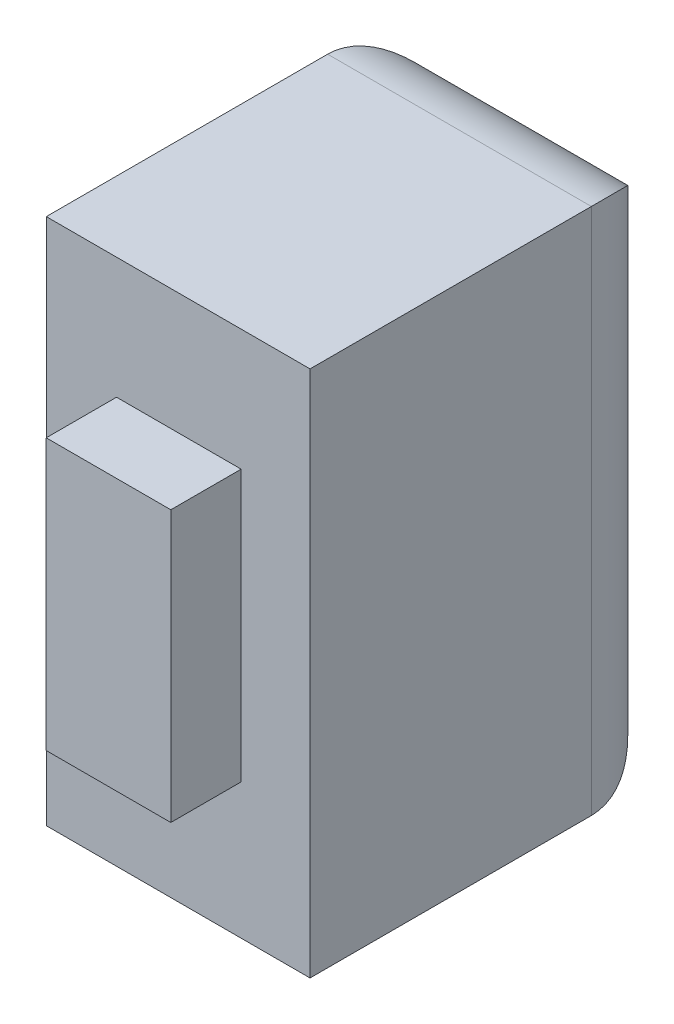
ISO-10303-21;
HEADER;
FILE_DESCRIPTION(('STEP AP214'),'2;1');
FILE_NAME('part.step','',(''),(''),'','','');
FILE_SCHEMA(('AUTOMOTIVE_DESIGN { 1 0 10303 214 1 1 1 1 }'));
ENDSEC;
DATA;
#1=APPLICATION_CONTEXT('core data for automotive mechanical design processes');
#2=APPLICATION_PROTOCOL_DEFINITION('international standard','automotive_design',2000,#1);
#3=PRODUCT_CONTEXT('',#1,'mechanical');
#4=PRODUCT('Part','Part','',(#3));
#5=PRODUCT_RELATED_PRODUCT_CATEGORY('part','',(#4));
#6=PRODUCT_DEFINITION_FORMATION('','',#4);
#7=PRODUCT_DEFINITION_CONTEXT('part definition',#1,'design');
#8=PRODUCT_DEFINITION('design','',#6,#7);
#9=PRODUCT_DEFINITION_SHAPE('','',#8);
#10=(LENGTH_UNIT() NAMED_UNIT(*) SI_UNIT(.MILLI.,.METRE.));
#11=(NAMED_UNIT(*) PLANE_ANGLE_UNIT() SI_UNIT($,.RADIAN.));
#12=(NAMED_UNIT(*) SI_UNIT($,.STERADIAN.) SOLID_ANGLE_UNIT());
#13=UNCERTAINTY_MEASURE_WITH_UNIT(LENGTH_MEASURE(1.E-05),#10,'distance_accuracy_value','');
#14=(GEOMETRIC_REPRESENTATION_CONTEXT(3) GLOBAL_UNCERTAINTY_ASSIGNED_CONTEXT((#13)) GLOBAL_UNIT_ASSIGNED_CONTEXT((#10,
#11,#12)) REPRESENTATION_CONTEXT('',''));
#15=CARTESIAN_POINT('',(0.,0.,0.));
#16=DIRECTION('',(0.,0.,1.));
#17=DIRECTION('',(1.,0.,0.));
#18=AXIS2_PLACEMENT_3D('',#15,#16,#17);
#19=CARTESIAN_POINT('',(-2.03853997780115,1.18298219692962,3.5));
#20=DIRECTION('',(1.,0.,0.));
#21=DIRECTION('',(0.,1.,0.));
#22=AXIS2_PLACEMENT_3D('',#19,#20,#21);
#23=PLANE('',#22);
#24=DIRECTION('',(0.,0.,-1.));
#25=VECTOR('',#24,1.);
#26=CARTESIAN_POINT('',(-2.03853997780115,1.18298219692962,3.5));
#27=LINE('',#26,#25);
#28=CARTESIAN_POINT('',(-2.03853997780115,1.18298219692962,2.7));
#29=VERTEX_POINT('',#28);
#30=CARTESIAN_POINT('',(-2.03853997780115,1.18298219692962,-0.5));
#31=VERTEX_POINT('',#30);
#32=EDGE_CURVE('E172',#29,#31,#27,.T.);
#33=ORIENTED_EDGE('',*,*,#32,.T.);
#34=DIRECTION('',(0.,1.,0.));
#35=VECTOR('',#34,1.);
#36=CARTESIAN_POINT('',(-2.03853997780115,-4.81701780307038,-0.5));
#37=LINE('',#36,#35);
#38=CARTESIAN_POINT('',(-2.03853997780115,-4.81701780307038,-0.5));
#39=VERTEX_POINT('',#38);
#40=EDGE_CURVE('E51',#31,#39,#37,.F.);
#41=ORIENTED_EDGE('',*,*,#40,.T.);
#42=DIRECTION('',(0.,0.,-1.));
#43=VECTOR('',#42,1.);
#44=CARTESIAN_POINT('',(-2.03853997780115,-4.81701780307038,3.5));
#45=LINE('',#44,#43);
#46=CARTESIAN_POINT('',(-2.03853997780115,-4.81701780307038,2.7));
#47=VERTEX_POINT('',#46);
#48=EDGE_CURVE('E179',#47,#39,#45,.T.);
#49=ORIENTED_EDGE('',*,*,#48,.F.);
#50=DIRECTION('',(0.,-1.,0.));
#51=VECTOR('',#50,1.);
#52=CARTESIAN_POINT('',(-2.03853997780115,1.18298219692962,2.7));
#53=LINE('',#52,#51);
#54=EDGE_CURVE('E170',#29,#47,#53,.T.);
#55=ORIENTED_EDGE('',*,*,#54,.F.);
#56=EDGE_LOOP('',(#33,#41,#49,#55));
#57=FACE_BOUND('',#56,.T.);
#58=ADVANCED_FACE('F42',(#57),#23,.F.);
#59=CARTESIAN_POINT('',(-2.03853997780115,-4.81701780307038,3.5));
#60=DIRECTION('',(0.,1.,0.));
#61=DIRECTION('',(0.,0.,1.));
#62=AXIS2_PLACEMENT_3D('',#59,#60,#61);
#63=PLANE('',#62);
#64=ORIENTED_EDGE('',*,*,#48,.T.);
#65=DIRECTION('',(-1.,0.,0.));
#66=VECTOR('',#65,1.);
#67=CARTESIAN_POINT('',(0.961460022198854,-4.81701780307038,-0.5));
#68=LINE('',#67,#66);
#69=CARTESIAN_POINT('',(0.961460022198855,-4.81701780307038,-0.5));
#70=VERTEX_POINT('',#69);
#71=EDGE_CURVE('E59',#39,#70,#68,.F.);
#72=ORIENTED_EDGE('',*,*,#71,.T.);
#73=DIRECTION('',(0.,0.,-1.));
#74=VECTOR('',#73,1.);
#75=CARTESIAN_POINT('',(0.961460022198855,-4.81701780307038,3.5));
#76=LINE('',#75,#74);
#77=CARTESIAN_POINT('',(0.961460022198855,-4.81701780307038,2.7));
#78=VERTEX_POINT('',#77);
#79=EDGE_CURVE('E177',#78,#70,#76,.T.);
#80=ORIENTED_EDGE('',*,*,#79,.F.);
#81=DIRECTION('',(1.,0.,0.));
#82=VECTOR('',#81,1.);
#83=CARTESIAN_POINT('',(-2.03853997780115,-4.81701780307038,2.7));
#84=LINE('',#83,#82);
#85=EDGE_CURVE('E168',#47,#78,#84,.T.);
#86=ORIENTED_EDGE('',*,*,#85,.F.);
#87=EDGE_LOOP('',(#64,#72,#80,#86));
#88=FACE_BOUND('',#87,.T.);
#89=ADVANCED_FACE('F242',(#88),#63,.F.);
#90=CARTESIAN_POINT('',(0.961460022198854,1.18298219692962,3.5));
#91=DIRECTION('',(-1.,0.,0.));
#92=DIRECTION('',(0.,-1.,0.));
#93=AXIS2_PLACEMENT_3D('',#90,#91,#92);
#94=PLANE('',#93);
#95=ORIENTED_EDGE('',*,*,#79,.T.);
#96=DIRECTION('',(0.,-1.,0.));
#97=VECTOR('',#96,1.);
#98=CARTESIAN_POINT('',(0.961460022198854,1.18298219692962,-0.5));
#99=LINE('',#98,#97);
#100=CARTESIAN_POINT('',(0.961460022198854,1.18298219692962,-0.5));
#101=VERTEX_POINT('',#100);
#102=EDGE_CURVE('E12',#70,#101,#99,.F.);
#103=ORIENTED_EDGE('',*,*,#102,.T.);
#104=DIRECTION('',(0.,0.,-1.));
#105=VECTOR('',#104,1.);
#106=CARTESIAN_POINT('',(0.961460022198854,1.18298219692962,3.5));
#107=LINE('',#106,#105);
#108=CARTESIAN_POINT('',(0.961460022198854,1.18298219692962,2.7));
#109=VERTEX_POINT('',#108);
#110=EDGE_CURVE('E174',#109,#101,#107,.T.);
#111=ORIENTED_EDGE('',*,*,#110,.F.);
#112=DIRECTION('',(0.,1.,0.));
#113=VECTOR('',#112,1.);
#114=CARTESIAN_POINT('',(0.961460022198854,1.18298219692962,2.7));
#115=LINE('',#114,#113);
#116=EDGE_CURVE('E163',#78,#109,#115,.T.);
#117=ORIENTED_EDGE('',*,*,#116,.F.);
#118=EDGE_LOOP('',(#95,#103,#111,#117));
#119=FACE_BOUND('',#118,.T.);
#120=ADVANCED_FACE('F218',(#119),#94,.F.);
#121=CARTESIAN_POINT('',(-2.03853997780115,1.18298219692962,3.5));
#122=DIRECTION('',(0.,-1.,0.));
#123=DIRECTION('',(0.,0.,-1.));
#124=AXIS2_PLACEMENT_3D('',#121,#122,#123);
#125=PLANE('',#124);
#126=ORIENTED_EDGE('',*,*,#110,.T.);
#127=DIRECTION('',(1.,0.,0.));
#128=VECTOR('',#127,1.);
#129=CARTESIAN_POINT('',(-2.03853997780115,1.18298219692962,-0.5));
#130=LINE('',#129,#128);
#131=EDGE_CURVE('E192',#101,#31,#130,.F.);
#132=ORIENTED_EDGE('',*,*,#131,.T.);
#133=ORIENTED_EDGE('',*,*,#32,.F.);
#134=DIRECTION('',(-1.,0.,0.));
#135=VECTOR('',#134,1.);
#136=CARTESIAN_POINT('',(-2.03853997780115,1.18298219692962,2.7));
#137=LINE('',#136,#135);
#138=EDGE_CURVE('E181',#109,#29,#137,.T.);
#139=ORIENTED_EDGE('',*,*,#138,.F.);
#140=EDGE_LOOP('',(#126,#132,#133,#139));
#141=FACE_BOUND('',#140,.T.);
#142=ADVANCED_FACE('F223',(#141),#125,.F.);
#143=CARTESIAN_POINT('',(-0.538539977801145,-1.81701780307038,2.7));
#144=DIRECTION('',(0.,0.,1.));
#145=DIRECTION('',(1.,0.,0.));
#146=AXIS2_PLACEMENT_3D('',#143,#144,#145);
#147=PLANE('',#146);
#148=DIRECTION('',(-1.,0.,0.));
#149=VECTOR('',#148,1.);
#150=CARTESIAN_POINT('',(-1.23949348205275,-0.196449222257141,2.7));
#151=LINE('',#150,#149);
#152=CARTESIAN_POINT('',(0.17791343994133,-0.196449222257141,2.7));
#153=VERTEX_POINT('',#152);
#154=CARTESIAN_POINT('',(-1.23949348205275,-0.196449222257141,2.7));
#155=VERTEX_POINT('',#154);
#156=EDGE_CURVE('E134',#153,#155,#151,.T.);
#157=ORIENTED_EDGE('',*,*,#156,.F.);
#158=DIRECTION('',(0.,1.,0.));
#159=VECTOR('',#158,1.);
#160=CARTESIAN_POINT('',(0.17791343994133,-0.196449222257141,2.7));
#161=LINE('',#160,#159);
#162=CARTESIAN_POINT('',(0.17791343994133,-3.27694693272427,2.7));
#163=VERTEX_POINT('',#162);
#164=EDGE_CURVE('E144',#163,#153,#161,.T.);
#165=ORIENTED_EDGE('',*,*,#164,.F.);
#166=DIRECTION('',(1.,0.,0.));
#167=VECTOR('',#166,1.);
#168=CARTESIAN_POINT('',(-1.23949348205275,-3.27694693272427,2.7));
#169=LINE('',#168,#167);
#170=CARTESIAN_POINT('',(-1.23949348205275,-3.27694693272427,2.7));
#171=VERTEX_POINT('',#170);
#172=EDGE_CURVE('E126',#171,#163,#169,.T.);
#173=ORIENTED_EDGE('',*,*,#172,.F.);
#174=DIRECTION('',(0.,-1.,0.));
#175=VECTOR('',#174,1.);
#176=CARTESIAN_POINT('',(-1.23949348205275,-0.196449222257141,2.7));
#177=LINE('',#176,#175);
#178=EDGE_CURVE('E141',#155,#171,#177,.T.);
#179=ORIENTED_EDGE('',*,*,#178,.F.);
#180=EDGE_LOOP('',(#157,#165,#173,#179));
#181=FACE_BOUND('',#180,.T.);
#182=ORIENTED_EDGE('',*,*,#54,.T.);
#183=ORIENTED_EDGE('',*,*,#85,.T.);
#184=ORIENTED_EDGE('',*,*,#116,.T.);
#185=ORIENTED_EDGE('',*,*,#138,.T.);
#186=EDGE_LOOP('',(#182,#183,#184,#185));
#187=FACE_BOUND('',#186,.T.);
#188=ADVANCED_FACE('F139',(#181,#187),#147,.T.);
#189=CARTESIAN_POINT('',(-1.23949348205275,-0.196449222257141,2.7));
#190=DIRECTION('',(-1.,0.,0.));
#191=DIRECTION('',(0.,0.,1.));
#192=AXIS2_PLACEMENT_3D('',#189,#190,#191);
#193=PLANE('',#192);
#194=DIRECTION('',(0.,-1.,0.));
#195=VECTOR('',#194,1.);
#196=CARTESIAN_POINT('',(-1.23949348205275,-0.196449222257141,3.5));
#197=LINE('',#196,#195);
#198=CARTESIAN_POINT('',(-1.23949348205275,-0.196449222257141,3.5));
#199=VERTEX_POINT('',#198);
#200=CARTESIAN_POINT('',(-1.23949348205275,-3.27694693272427,3.5));
#201=VERTEX_POINT('',#200);
#202=EDGE_CURVE('E157',#199,#201,#197,.T.);
#203=ORIENTED_EDGE('',*,*,#202,.F.);
#204=DIRECTION('',(0.,0.,1.));
#205=VECTOR('',#204,1.);
#206=CARTESIAN_POINT('',(-1.23949348205275,-0.196449222257141,2.7));
#207=LINE('',#206,#205);
#208=EDGE_CURVE('E148',#155,#199,#207,.T.);
#209=ORIENTED_EDGE('',*,*,#208,.F.);
#210=ORIENTED_EDGE('',*,*,#178,.T.);
#211=DIRECTION('',(0.,0.,1.));
#212=VECTOR('',#211,1.);
#213=CARTESIAN_POINT('',(-1.23949348205275,-3.27694693272427,2.7));
#214=LINE('',#213,#212);
#215=EDGE_CURVE('E122',#171,#201,#214,.T.);
#216=ORIENTED_EDGE('',*,*,#215,.T.);
#217=EDGE_LOOP('',(#203,#209,#210,#216));
#218=FACE_BOUND('',#217,.T.);
#219=ADVANCED_FACE('F147',(#218),#193,.T.);
#220=CARTESIAN_POINT('',(-1.23949348205275,-0.196449222257141,2.7));
#221=DIRECTION('',(0.,1.,0.));
#222=DIRECTION('',(0.,0.,1.));
#223=AXIS2_PLACEMENT_3D('',#220,#221,#222);
#224=PLANE('',#223);
#225=DIRECTION('',(-1.,0.,0.));
#226=VECTOR('',#225,1.);
#227=CARTESIAN_POINT('',(-1.23949348205275,-0.196449222257141,3.5));
#228=LINE('',#227,#226);
#229=CARTESIAN_POINT('',(0.17791343994133,-0.196449222257141,3.5));
#230=VERTEX_POINT('',#229);
#231=EDGE_CURVE('E149',#230,#199,#228,.T.);
#232=ORIENTED_EDGE('',*,*,#231,.F.);
#233=DIRECTION('',(0.,0.,1.));
#234=VECTOR('',#233,1.);
#235=CARTESIAN_POINT('',(0.17791343994133,-0.196449222257141,2.7));
#236=LINE('',#235,#234);
#237=EDGE_CURVE('E164',#153,#230,#236,.T.);
#238=ORIENTED_EDGE('',*,*,#237,.F.);
#239=ORIENTED_EDGE('',*,*,#156,.T.);
#240=ORIENTED_EDGE('',*,*,#208,.T.);
#241=EDGE_LOOP('',(#232,#238,#239,#240));
#242=FACE_BOUND('',#241,.T.);
#243=ADVANCED_FACE('F296',(#242),#224,.T.);
#244=CARTESIAN_POINT('',(0.17791343994133,-0.196449222257141,2.7));
#245=DIRECTION('',(1.,0.,0.));
#246=DIRECTION('',(0.,0.,-1.));
#247=AXIS2_PLACEMENT_3D('',#244,#245,#246);
#248=PLANE('',#247);
#249=DIRECTION('',(0.,1.,0.));
#250=VECTOR('',#249,1.);
#251=CARTESIAN_POINT('',(0.17791343994133,-0.196449222257141,3.5));
#252=LINE('',#251,#250);
#253=CARTESIAN_POINT('',(0.17791343994133,-3.27694693272427,3.5));
#254=VERTEX_POINT('',#253);
#255=EDGE_CURVE('E152',#254,#230,#252,.T.);
#256=ORIENTED_EDGE('',*,*,#255,.F.);
#257=DIRECTION('',(0.,0.,1.));
#258=VECTOR('',#257,1.);
#259=CARTESIAN_POINT('',(0.17791343994133,-3.27694693272427,2.7));
#260=LINE('',#259,#258);
#261=EDGE_CURVE('E133',#163,#254,#260,.T.);
#262=ORIENTED_EDGE('',*,*,#261,.F.);
#263=ORIENTED_EDGE('',*,*,#164,.T.);
#264=ORIENTED_EDGE('',*,*,#237,.T.);
#265=EDGE_LOOP('',(#256,#262,#263,#264));
#266=FACE_BOUND('',#265,.T.);
#267=ADVANCED_FACE('F288',(#266),#248,.T.);
#268=CARTESIAN_POINT('',(-1.23949348205275,-3.27694693272427,2.7));
#269=DIRECTION('',(0.,-1.,0.));
#270=DIRECTION('',(0.,0.,-1.));
#271=AXIS2_PLACEMENT_3D('',#268,#269,#270);
#272=PLANE('',#271);
#273=DIRECTION('',(1.,0.,0.));
#274=VECTOR('',#273,1.);
#275=CARTESIAN_POINT('',(-1.23949348205275,-3.27694693272427,3.5));
#276=LINE('',#275,#274);
#277=EDGE_CURVE('E128',#201,#254,#276,.T.);
#278=ORIENTED_EDGE('',*,*,#277,.F.);
#279=ORIENTED_EDGE('',*,*,#215,.F.);
#280=ORIENTED_EDGE('',*,*,#172,.T.);
#281=ORIENTED_EDGE('',*,*,#261,.T.);
#282=EDGE_LOOP('',(#278,#279,#280,#281));
#283=FACE_BOUND('',#282,.T.);
#284=ADVANCED_FACE('F124',(#283),#272,.T.);
#285=CARTESIAN_POINT('',(0.,0.,3.5));
#286=DIRECTION('',(0.,0.,1.));
#287=DIRECTION('',(1.,0.,0.));
#288=AXIS2_PLACEMENT_3D('',#285,#286,#287);
#289=PLANE('',#288);
#290=ORIENTED_EDGE('',*,*,#231,.T.);
#291=ORIENTED_EDGE('',*,*,#202,.T.);
#292=ORIENTED_EDGE('',*,*,#277,.T.);
#293=ORIENTED_EDGE('',*,*,#255,.T.);
#294=EDGE_LOOP('',(#290,#291,#292,#293));
#295=FACE_BOUND('',#294,.T.);
#296=ADVANCED_FACE('F231',(#295),#289,.T.);
#297=CARTESIAN_POINT('',(0.,0.,-1.5));
#298=DIRECTION('',(0.,0.,-1.));
#299=DIRECTION('',(-1.,0.,0.));
#300=AXIS2_PLACEMENT_3D('',#297,#298,#299);
#301=PLANE('',#300);
#302=DIRECTION('',(-1.,0.,0.));
#303=VECTOR('',#302,1.);
#304=CARTESIAN_POINT('',(-2.03853997780115,-3.81701780307038,-1.5));
#305=LINE('',#304,#303);
#306=CARTESIAN_POINT('',(-0.0385399778011451,-3.81701780307038,-1.5));
#307=VERTEX_POINT('',#306);
#308=CARTESIAN_POINT('',(-1.03853997780115,-3.81701780307038,-1.5));
#309=VERTEX_POINT('',#308);
#310=EDGE_CURVE('E185',#307,#309,#305,.T.);
#311=ORIENTED_EDGE('',*,*,#310,.T.);
#312=DIRECTION('',(0.,1.,0.));
#313=VECTOR('',#312,1.);
#314=CARTESIAN_POINT('',(-1.03853997780115,1.18298219692962,-1.5));
#315=LINE('',#314,#313);
#316=CARTESIAN_POINT('',(-1.03853997780115,0.182982196929617,-1.5));
#317=VERTEX_POINT('',#316);
#318=EDGE_CURVE('E190',#309,#317,#315,.T.);
#319=ORIENTED_EDGE('',*,*,#318,.T.);
#320=DIRECTION('',(1.,0.,0.));
#321=VECTOR('',#320,1.);
#322=CARTESIAN_POINT('',(0.961460022198854,0.182982196929617,-1.5));
#323=LINE('',#322,#321);
#324=CARTESIAN_POINT('',(-0.0385399778011458,0.182982196929617,-1.5));
#325=VERTEX_POINT('',#324);
#326=EDGE_CURVE('E187',#317,#325,#323,.T.);
#327=ORIENTED_EDGE('',*,*,#326,.T.);
#328=DIRECTION('',(0.,-1.,0.));
#329=VECTOR('',#328,1.);
#330=CARTESIAN_POINT('',(-0.0385399778011449,-4.81701780307038,-1.5));
#331=LINE('',#330,#329);
#332=EDGE_CURVE('E183',#325,#307,#331,.T.);
#333=ORIENTED_EDGE('',*,*,#332,.T.);
#334=EDGE_LOOP('',(#311,#319,#327,#333));
#335=FACE_BOUND('',#334,.T.);
#336=ADVANCED_FACE('F229',(#335),#301,.T.);
#337=CARTESIAN_POINT('',(0.,-3.81701780307038,-0.5));
#338=DIRECTION('',(1.,0.,0.));
#339=DIRECTION('',(0.,0.,-1.));
#340=AXIS2_PLACEMENT_3D('',#337,#338,#339);
#341=CYLINDRICAL_SURFACE('',#340,1.);
#342=CARTESIAN_POINT('',(-0.0385399778011451,-3.81701780307038,-0.5));
#343=DIRECTION('',(0.707106781186547,0.707106781186548,0.));
#344=DIRECTION('',(-0.707106781186548,0.707106781186547,0.));
#345=AXIS2_PLACEMENT_3D('',#342,#343,#344);
#346=ELLIPSE('',#345,1.4142135623731,1.);
#347=EDGE_CURVE('E200',#70,#307,#346,.T.);
#348=ORIENTED_EDGE('',*,*,#347,.F.);
#349=ORIENTED_EDGE('',*,*,#71,.F.);
#350=CARTESIAN_POINT('',(-1.03853997780115,-3.81701780307038,-0.5));
#351=DIRECTION('',(0.707106781186547,-0.707106781186547,0.));
#352=DIRECTION('',(-0.707106781186547,-0.707106781186548,0.));
#353=AXIS2_PLACEMENT_3D('',#350,#351,#352);
#354=ELLIPSE('',#353,1.41421356237309,1.);
#355=EDGE_CURVE('E46',#309,#39,#354,.F.);
#356=ORIENTED_EDGE('',*,*,#355,.F.);
#357=ORIENTED_EDGE('',*,*,#310,.F.);
#358=EDGE_LOOP('',(#348,#349,#356,#357));
#359=FACE_BOUND('',#358,.T.);
#360=ADVANCED_FACE('F44',(#359),#341,.T.);
#361=CARTESIAN_POINT('',(-1.03853997780115,0.,-0.5));
#362=DIRECTION('',(0.,-1.,0.));
#363=DIRECTION('',(1.,0.,0.));
#364=AXIS2_PLACEMENT_3D('',#361,#362,#363);
#365=CYLINDRICAL_SURFACE('',#364,1.);
#366=ORIENTED_EDGE('',*,*,#355,.T.);
#367=ORIENTED_EDGE('',*,*,#40,.F.);
#368=CARTESIAN_POINT('',(-1.03853997780115,0.182982196929617,-0.5));
#369=DIRECTION('',(-0.707106781186547,-0.707106781186548,0.));
#370=DIRECTION('',(0.707106781186547,-0.707106781186547,0.));
#371=AXIS2_PLACEMENT_3D('',#368,#369,#370);
#372=ELLIPSE('',#371,1.4142135623731,1.);
#373=EDGE_CURVE('E199',#317,#31,#372,.F.);
#374=ORIENTED_EDGE('',*,*,#373,.F.);
#375=ORIENTED_EDGE('',*,*,#318,.F.);
#376=EDGE_LOOP('',(#366,#367,#374,#375));
#377=FACE_BOUND('',#376,.T.);
#378=ADVANCED_FACE('F210',(#377),#365,.T.);
#379=CARTESIAN_POINT('',(-0.0385399778011457,0.,-0.5));
#380=DIRECTION('',(0.,1.,0.));
#381=DIRECTION('',(-1.,0.,0.));
#382=AXIS2_PLACEMENT_3D('',#379,#380,#381);
#383=CYLINDRICAL_SURFACE('',#382,1.);
#384=ORIENTED_EDGE('',*,*,#347,.T.);
#385=ORIENTED_EDGE('',*,*,#332,.F.);
#386=CARTESIAN_POINT('',(-0.0385399778011458,0.182982196929617,-0.5));
#387=DIRECTION('',(-0.707106781186548,0.707106781186547,0.));
#388=DIRECTION('',(0.707106781186547,0.707106781186548,0.));
#389=AXIS2_PLACEMENT_3D('',#386,#387,#388);
#390=ELLIPSE('',#389,1.41421356237309,1.);
#391=EDGE_CURVE('E197',#101,#325,#390,.T.);
#392=ORIENTED_EDGE('',*,*,#391,.F.);
#393=ORIENTED_EDGE('',*,*,#102,.F.);
#394=EDGE_LOOP('',(#384,#385,#392,#393));
#395=FACE_BOUND('',#394,.T.);
#396=ADVANCED_FACE('F215',(#395),#383,.T.);
#397=CARTESIAN_POINT('',(0.,0.182982196929617,-0.5));
#398=DIRECTION('',(-1.,0.,0.));
#399=DIRECTION('',(0.,0.,1.));
#400=AXIS2_PLACEMENT_3D('',#397,#398,#399);
#401=CYLINDRICAL_SURFACE('',#400,1.);
#402=ORIENTED_EDGE('',*,*,#373,.T.);
#403=ORIENTED_EDGE('',*,*,#131,.F.);
#404=ORIENTED_EDGE('',*,*,#391,.T.);
#405=ORIENTED_EDGE('',*,*,#326,.F.);
#406=EDGE_LOOP('',(#402,#403,#404,#405));
#407=FACE_BOUND('',#406,.T.);
#408=ADVANCED_FACE('F226',(#407),#401,.T.);
#409=CLOSED_SHELL('',(#58,#89,#120,#142,#188,#219,#243,#267,#284,#296,#336,#360,#378,#396,#408));
#410=MANIFOLD_SOLID_BREP('B2',#409);
#411=ADVANCED_BREP_SHAPE_REPRESENTATION('',(#18,#410),#14);
#412=SHAPE_DEFINITION_REPRESENTATION(#9,#411);
ENDSEC;
END-ISO-10303-21;
